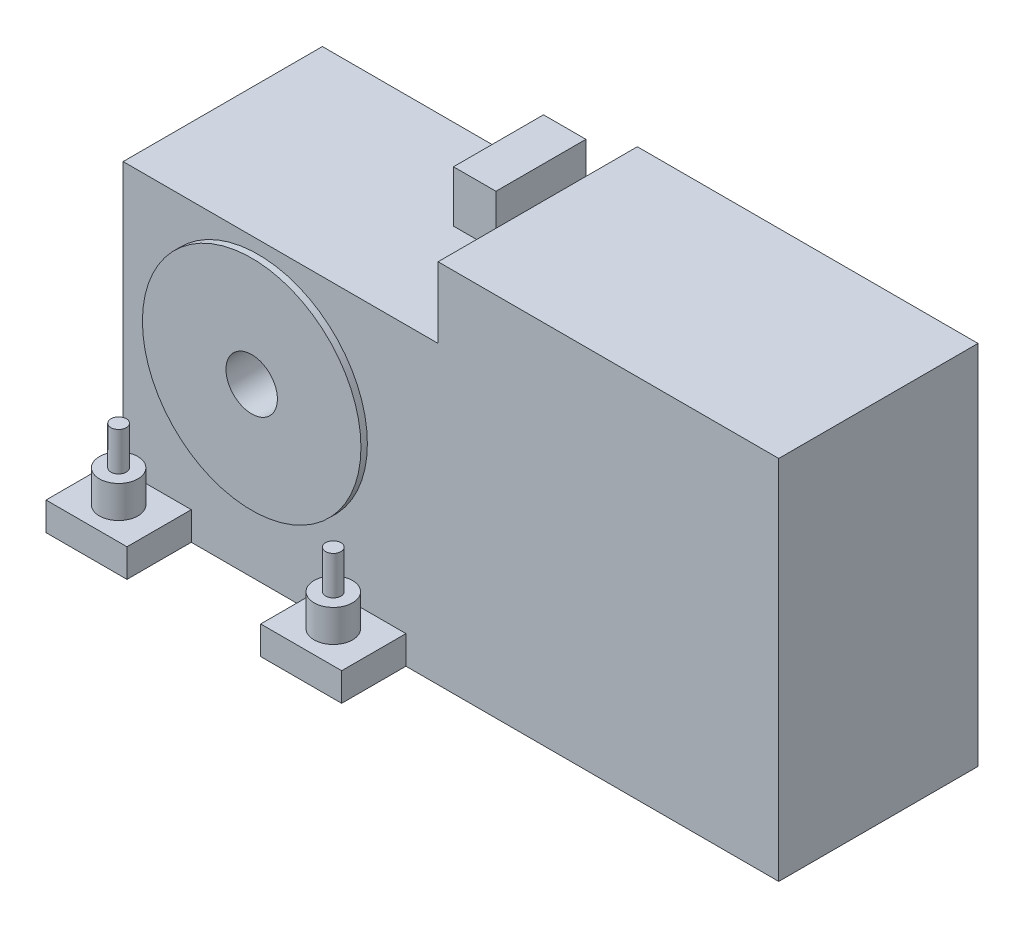
ISO-10303-21;
HEADER;
FILE_DESCRIPTION(('STEP AP214'),'2;1');
FILE_NAME('part.step','',(''),(''),'','','');
FILE_SCHEMA(('AUTOMOTIVE_DESIGN { 1 0 10303 214 1 1 1 1 }'));
ENDSEC;
DATA;
#1=APPLICATION_CONTEXT('core data for automotive mechanical design processes');
#2=APPLICATION_PROTOCOL_DEFINITION('international standard','automotive_design',2000,#1);
#3=PRODUCT_CONTEXT('',#1,'mechanical');
#4=PRODUCT('Part','Part','',(#3));
#5=PRODUCT_RELATED_PRODUCT_CATEGORY('part','',(#4));
#6=PRODUCT_DEFINITION_FORMATION('','',#4);
#7=PRODUCT_DEFINITION_CONTEXT('part definition',#1,'design');
#8=PRODUCT_DEFINITION('design','',#6,#7);
#9=PRODUCT_DEFINITION_SHAPE('','',#8);
#10=(LENGTH_UNIT() NAMED_UNIT(*) SI_UNIT(.MILLI.,.METRE.));
#11=(NAMED_UNIT(*) PLANE_ANGLE_UNIT() SI_UNIT($,.RADIAN.));
#12=(NAMED_UNIT(*) SI_UNIT($,.STERADIAN.) SOLID_ANGLE_UNIT());
#13=UNCERTAINTY_MEASURE_WITH_UNIT(LENGTH_MEASURE(1.E-05),#10,'distance_accuracy_value','');
#14=(GEOMETRIC_REPRESENTATION_CONTEXT(3) GLOBAL_UNCERTAINTY_ASSIGNED_CONTEXT((#13)) GLOBAL_UNIT_ASSIGNED_CONTEXT((#10,
#11,#12)) REPRESENTATION_CONTEXT('',''));
#15=CARTESIAN_POINT('',(0.,0.,0.));
#16=DIRECTION('',(0.,0.,1.));
#17=DIRECTION('',(1.,0.,0.));
#18=AXIS2_PLACEMENT_3D('',#15,#16,#17);
#19=CARTESIAN_POINT('',(0.,0.,0.));
#20=DIRECTION('',(0.,0.,-1.));
#21=DIRECTION('',(-1.,0.,0.));
#22=AXIS2_PLACEMENT_3D('',#19,#20,#21);
#23=PLANE('',#22);
#24=CARTESIAN_POINT('',(0.,0.,0.));
#25=DIRECTION('',(0.,0.,1.));
#26=DIRECTION('',(1.,0.,0.));
#27=AXIS2_PLACEMENT_3D('',#24,#25,#26);
#28=CIRCLE('',#27,85.);
#29=CARTESIAN_POINT('',(85.,0.,0.));
#30=VERTEX_POINT('',#29);
#31=EDGE_CURVE('E45',#30,#30,#28,.T.);
#32=ORIENTED_EDGE('',*,*,#31,.F.);
#33=EDGE_LOOP('',(#32));
#34=FACE_BOUND('',#33,.T.);
#35=DIRECTION('',(0.,-1.,0.));
#36=VECTOR('',#35,1.);
#37=CARTESIAN_POINT('',(52.,-113.,0.));
#38=LINE('',#37,#36);
#39=CARTESIAN_POINT('',(52.,-113.,0.));
#40=VERTEX_POINT('',#39);
#41=CARTESIAN_POINT('',(52.,-135.,0.));
#42=VERTEX_POINT('',#41);
#43=EDGE_CURVE('E57',#40,#42,#38,.T.);
#44=ORIENTED_EDGE('',*,*,#43,.F.);
#45=DIRECTION('',(-1.,0.,0.));
#46=VECTOR('',#45,1.);
#47=CARTESIAN_POINT('',(0.,-113.,0.));
#48=LINE('',#47,#46);
#49=CARTESIAN_POINT('',(115.,-113.,0.));
#50=VERTEX_POINT('',#49);
#51=EDGE_CURVE('E62',#50,#40,#48,.T.);
#52=ORIENTED_EDGE('',*,*,#51,.F.);
#53=DIRECTION('',(0.,-1.,0.));
#54=VECTOR('',#53,1.);
#55=CARTESIAN_POINT('',(115.,-113.,0.));
#56=LINE('',#55,#54);
#57=CARTESIAN_POINT('',(115.,-135.,0.));
#58=VERTEX_POINT('',#57);
#59=EDGE_CURVE('E181',#50,#58,#56,.T.);
#60=ORIENTED_EDGE('',*,*,#59,.T.);
#61=DIRECTION('',(1.,0.,0.));
#62=VECTOR('',#61,1.);
#63=CARTESIAN_POINT('',(0.,-135.,0.));
#64=LINE('',#63,#62);
#65=CARTESIAN_POINT('',(405.,-135.,0.));
#66=VERTEX_POINT('',#65);
#67=EDGE_CURVE('E263',#58,#66,#64,.T.);
#68=ORIENTED_EDGE('',*,*,#67,.T.);
#69=DIRECTION('',(0.,-1.,0.));
#70=VECTOR('',#69,1.);
#71=CARTESIAN_POINT('',(405.,-1.57768535078312E-13,0.));
#72=LINE('',#71,#70);
#73=CARTESIAN_POINT('',(405.,150.,0.));
#74=VERTEX_POINT('',#73);
#75=EDGE_CURVE('E275',#74,#66,#72,.T.);
#76=ORIENTED_EDGE('',*,*,#75,.F.);
#77=DIRECTION('',(-1.,0.,0.));
#78=VECTOR('',#77,1.);
#79=CARTESIAN_POINT('',(0.,150.,0.));
#80=LINE('',#79,#78);
#81=CARTESIAN_POINT('',(140.,150.,0.));
#82=VERTEX_POINT('',#81);
#83=EDGE_CURVE('E306',#74,#82,#80,.T.);
#84=ORIENTED_EDGE('',*,*,#83,.T.);
#85=DIRECTION('',(0.,-1.,0.));
#86=VECTOR('',#85,1.);
#87=CARTESIAN_POINT('',(140.,0.,0.));
#88=LINE('',#87,#86);
#89=CARTESIAN_POINT('',(140.,95.,0.));
#90=VERTEX_POINT('',#89);
#91=EDGE_CURVE('E303',#82,#90,#88,.T.);
#92=ORIENTED_EDGE('',*,*,#91,.T.);
#93=DIRECTION('',(1.,0.,0.));
#94=VECTOR('',#93,1.);
#95=CARTESIAN_POINT('',(0.,95.,0.));
#96=LINE('',#95,#94);
#97=CARTESIAN_POINT('',(-105.,95.,0.));
#98=VERTEX_POINT('',#97);
#99=EDGE_CURVE('E300',#98,#90,#96,.T.);
#100=ORIENTED_EDGE('',*,*,#99,.F.);
#101=DIRECTION('',(0.,-1.,0.));
#102=VECTOR('',#101,1.);
#103=CARTESIAN_POINT('',(-105.,0.,0.));
#104=LINE('',#103,#102);
#105=CARTESIAN_POINT('',(-105.,-113.,0.));
#106=VERTEX_POINT('',#105);
#107=EDGE_CURVE('E297',#98,#106,#104,.T.);
#108=ORIENTED_EDGE('',*,*,#107,.T.);
#109=DIRECTION('',(-1.,0.,0.));
#110=VECTOR('',#109,1.);
#111=CARTESIAN_POINT('',(0.,-113.,0.));
#112=LINE('',#111,#110);
#113=CARTESIAN_POINT('',(-52.,-113.,0.));
#114=VERTEX_POINT('',#113);
#115=EDGE_CURVE('E211',#114,#106,#112,.T.);
#116=ORIENTED_EDGE('',*,*,#115,.F.);
#117=DIRECTION('',(0.,-1.,0.));
#118=VECTOR('',#117,1.);
#119=CARTESIAN_POINT('',(-52.,-113.,0.));
#120=LINE('',#119,#118);
#121=CARTESIAN_POINT('',(-52.,-135.,0.));
#122=VERTEX_POINT('',#121);
#123=EDGE_CURVE('E222',#114,#122,#120,.T.);
#124=ORIENTED_EDGE('',*,*,#123,.T.);
#125=EDGE_CURVE('E294',#122,#42,#64,.T.);
#126=ORIENTED_EDGE('',*,*,#125,.T.);
#127=EDGE_LOOP('',(#44,#52,#60,#68,#76,#84,#92,#100,#108,#116,#124,#126));
#128=FACE_BOUND('',#127,.T.);
#129=ADVANCED_FACE('F41',(#34,#128),#23,.F.);
#130=CARTESIAN_POINT('',(0.,95.,-155.));
#131=DIRECTION('',(0.,-1.,0.));
#132=DIRECTION('',(1.,0.,0.));
#133=AXIS2_PLACEMENT_3D('',#130,#131,#132);
#134=PLANE('',#133);
#135=DIRECTION('',(0.,0.,-1.));
#136=VECTOR('',#135,1.);
#137=CARTESIAN_POINT('',(100.,95.,-85.));
#138=LINE('',#137,#136);
#139=CARTESIAN_POINT('',(100.,95.,-85.));
#140=VERTEX_POINT('',#139);
#141=CARTESIAN_POINT('',(100.,95.,-155.));
#142=VERTEX_POINT('',#141);
#143=EDGE_CURVE('E261',#140,#142,#138,.T.);
#144=ORIENTED_EDGE('',*,*,#143,.F.);
#145=DIRECTION('',(1.,0.,0.));
#146=VECTOR('',#145,1.);
#147=CARTESIAN_POINT('',(0.,95.,-85.));
#148=LINE('',#147,#146);
#149=CARTESIAN_POINT('',(67.0000000000001,95.,-85.));
#150=VERTEX_POINT('',#149);
#151=EDGE_CURVE('E243',#150,#140,#148,.T.);
#152=ORIENTED_EDGE('',*,*,#151,.F.);
#153=DIRECTION('',(0.,0.,-1.));
#154=VECTOR('',#153,1.);
#155=CARTESIAN_POINT('',(67.0000000000001,95.,-85.));
#156=LINE('',#155,#154);
#157=CARTESIAN_POINT('',(67.0000000000001,95.,-155.));
#158=VERTEX_POINT('',#157);
#159=EDGE_CURVE('E254',#150,#158,#156,.T.);
#160=ORIENTED_EDGE('',*,*,#159,.T.);
#161=DIRECTION('',(1.,0.,0.));
#162=VECTOR('',#161,1.);
#163=CARTESIAN_POINT('',(0.,95.,-155.));
#164=LINE('',#163,#162);
#165=CARTESIAN_POINT('',(-105.,95.,-155.));
#166=VERTEX_POINT('',#165);
#167=EDGE_CURVE('E279',#166,#158,#164,.T.);
#168=ORIENTED_EDGE('',*,*,#167,.F.);
#169=DIRECTION('',(0.,0.,1.));
#170=VECTOR('',#169,1.);
#171=CARTESIAN_POINT('',(-105.,95.,-155.));
#172=LINE('',#171,#170);
#173=EDGE_CURVE('E319',#166,#98,#172,.T.);
#174=ORIENTED_EDGE('',*,*,#173,.T.);
#175=ORIENTED_EDGE('',*,*,#99,.T.);
#176=DIRECTION('',(0.,0.,1.));
#177=VECTOR('',#176,1.);
#178=CARTESIAN_POINT('',(140.,95.,-155.));
#179=LINE('',#178,#177);
#180=CARTESIAN_POINT('',(140.,95.,-155.));
#181=VERTEX_POINT('',#180);
#182=EDGE_CURVE('E317',#181,#90,#179,.T.);
#183=ORIENTED_EDGE('',*,*,#182,.F.);
#184=EDGE_CURVE('E278',#142,#181,#164,.T.);
#185=ORIENTED_EDGE('',*,*,#184,.F.);
#186=EDGE_LOOP('',(#144,#152,#160,#168,#174,#175,#183,#185));
#187=FACE_BOUND('',#186,.T.);
#188=ADVANCED_FACE('F332',(#187),#134,.F.);
#189=CARTESIAN_POINT('',(0.,0.,5.));
#190=DIRECTION('',(0.,0.,-1.));
#191=DIRECTION('',(-1.,0.,0.));
#192=AXIS2_PLACEMENT_3D('',#189,#190,#191);
#193=CYLINDRICAL_SURFACE('',#192,20.);
#194=CARTESIAN_POINT('',(0.,0.,5.));
#195=DIRECTION('',(0.,0.,1.));
#196=DIRECTION('',(1.,0.,0.));
#197=AXIS2_PLACEMENT_3D('',#194,#195,#196);
#198=CIRCLE('',#197,20.);
#199=CARTESIAN_POINT('',(20.,0.,5.));
#200=VERTEX_POINT('',#199);
#201=EDGE_CURVE('E50',#200,#200,#198,.T.);
#202=ORIENTED_EDGE('',*,*,#201,.T.);
#203=EDGE_LOOP('',(#202));
#204=FACE_BOUND('',#203,.T.);
#205=CARTESIAN_POINT('',(0.,0.,-155.));
#206=DIRECTION('',(0.,0.,-1.));
#207=DIRECTION('',(-1.,0.,0.));
#208=AXIS2_PLACEMENT_3D('',#205,#206,#207);
#209=CIRCLE('',#208,20.);
#210=CARTESIAN_POINT('',(-20.,0.,-155.));
#211=VERTEX_POINT('',#210);
#212=EDGE_CURVE('E290',#211,#211,#209,.F.);
#213=ORIENTED_EDGE('',*,*,#212,.F.);
#214=EDGE_LOOP('',(#213));
#215=FACE_BOUND('',#214,.T.);
#216=ADVANCED_FACE('F43',(#204,#215),#193,.F.);
#217=CARTESIAN_POINT('',(0.,0.,5.));
#218=DIRECTION('',(0.,0.,-1.));
#219=DIRECTION('',(-1.,0.,0.));
#220=AXIS2_PLACEMENT_3D('',#217,#218,#219);
#221=CYLINDRICAL_SURFACE('',#220,85.);
#222=CARTESIAN_POINT('',(0.,0.,5.));
#223=DIRECTION('',(0.,0.,1.));
#224=DIRECTION('',(1.,0.,0.));
#225=AXIS2_PLACEMENT_3D('',#222,#223,#224);
#226=CIRCLE('',#225,85.);
#227=CARTESIAN_POINT('',(85.,0.,5.));
#228=VERTEX_POINT('',#227);
#229=EDGE_CURVE('E11',#228,#228,#226,.T.);
#230=ORIENTED_EDGE('',*,*,#229,.F.);
#231=EDGE_LOOP('',(#230));
#232=FACE_BOUND('',#231,.T.);
#233=ORIENTED_EDGE('',*,*,#31,.T.);
#234=EDGE_LOOP('',(#233));
#235=FACE_BOUND('',#234,.T.);
#236=ADVANCED_FACE('F329',(#232,#235),#221,.T.);
#237=CARTESIAN_POINT('',(0.,0.,5.));
#238=DIRECTION('',(0.,0.,1.));
#239=DIRECTION('',(1.,0.,0.));
#240=AXIS2_PLACEMENT_3D('',#237,#238,#239);
#241=PLANE('',#240);
#242=ORIENTED_EDGE('',*,*,#201,.F.);
#243=EDGE_LOOP('',(#242));
#244=FACE_BOUND('',#243,.T.);
#245=ORIENTED_EDGE('',*,*,#229,.T.);
#246=EDGE_LOOP('',(#245));
#247=FACE_BOUND('',#246,.T.);
#248=ADVANCED_FACE('F363',(#244,#247),#241,.T.);
#249=CARTESIAN_POINT('',(0.,-135.,-155.));
#250=DIRECTION('',(0.,-1.,0.));
#251=DIRECTION('',(0.,0.,-1.));
#252=AXIS2_PLACEMENT_3D('',#249,#250,#251);
#253=PLANE('',#252);
#254=ORIENTED_EDGE('',*,*,#125,.F.);
#255=DIRECTION('',(0.,0.,1.));
#256=VECTOR('',#255,1.);
#257=CARTESIAN_POINT('',(-52.,-135.,0.));
#258=LINE('',#257,#256);
#259=CARTESIAN_POINT('',(-52.,-135.,50.));
#260=VERTEX_POINT('',#259);
#261=EDGE_CURVE('E224',#122,#260,#258,.T.);
#262=ORIENTED_EDGE('',*,*,#261,.T.);
#263=DIRECTION('',(1.,0.,0.));
#264=VECTOR('',#263,1.);
#265=CARTESIAN_POINT('',(0.,-135.,50.));
#266=LINE('',#265,#264);
#267=CARTESIAN_POINT('',(-115.,-135.,50.));
#268=VERTEX_POINT('',#267);
#269=EDGE_CURVE('E227',#268,#260,#266,.T.);
#270=ORIENTED_EDGE('',*,*,#269,.F.);
#271=DIRECTION('',(0.,0.,1.));
#272=VECTOR('',#271,1.);
#273=CARTESIAN_POINT('',(-115.,-135.,0.));
#274=LINE('',#273,#272);
#275=CARTESIAN_POINT('',(-115.,-135.,0.));
#276=VERTEX_POINT('',#275);
#277=EDGE_CURVE('E230',#276,#268,#274,.T.);
#278=ORIENTED_EDGE('',*,*,#277,.F.);
#279=DIRECTION('',(-1.,0.,0.));
#280=VECTOR('',#279,1.);
#281=CARTESIAN_POINT('',(0.,-135.,0.));
#282=LINE('',#281,#280);
#283=CARTESIAN_POINT('',(-105.,-135.,0.));
#284=VERTEX_POINT('',#283);
#285=EDGE_CURVE('E208',#284,#276,#282,.T.);
#286=ORIENTED_EDGE('',*,*,#285,.F.);
#287=DIRECTION('',(0.,0.,1.));
#288=VECTOR('',#287,1.);
#289=CARTESIAN_POINT('',(-105.,-135.,-155.));
#290=LINE('',#289,#288);
#291=CARTESIAN_POINT('',(-105.,-135.,-155.));
#292=VERTEX_POINT('',#291);
#293=EDGE_CURVE('E321',#292,#284,#290,.T.);
#294=ORIENTED_EDGE('',*,*,#293,.F.);
#295=DIRECTION('',(1.,0.,0.));
#296=VECTOR('',#295,1.);
#297=CARTESIAN_POINT('',(0.,-135.,-155.));
#298=LINE('',#297,#296);
#299=CARTESIAN_POINT('',(405.,-135.,-155.));
#300=VERTEX_POINT('',#299);
#301=EDGE_CURVE('E271',#292,#300,#298,.T.);
#302=ORIENTED_EDGE('',*,*,#301,.T.);
#303=DIRECTION('',(0.,0.,1.));
#304=VECTOR('',#303,1.);
#305=CARTESIAN_POINT('',(405.,-135.,-155.));
#306=LINE('',#305,#304);
#307=EDGE_CURVE('E293',#300,#66,#306,.T.);
#308=ORIENTED_EDGE('',*,*,#307,.T.);
#309=ORIENTED_EDGE('',*,*,#67,.F.);
#310=DIRECTION('',(0.,0.,1.));
#311=VECTOR('',#310,1.);
#312=CARTESIAN_POINT('',(115.,-135.,0.));
#313=LINE('',#312,#311);
#314=CARTESIAN_POINT('',(115.,-135.,50.));
#315=VERTEX_POINT('',#314);
#316=EDGE_CURVE('E201',#58,#315,#313,.T.);
#317=ORIENTED_EDGE('',*,*,#316,.T.);
#318=DIRECTION('',(-1.,0.,0.));
#319=VECTOR('',#318,1.);
#320=CARTESIAN_POINT('',(0.,-135.,50.));
#321=LINE('',#320,#319);
#322=CARTESIAN_POINT('',(52.,-135.,50.));
#323=VERTEX_POINT('',#322);
#324=EDGE_CURVE('E175',#315,#323,#321,.T.);
#325=ORIENTED_EDGE('',*,*,#324,.T.);
#326=DIRECTION('',(0.,0.,1.));
#327=VECTOR('',#326,1.);
#328=CARTESIAN_POINT('',(52.,-135.,0.));
#329=LINE('',#328,#327);
#330=EDGE_CURVE('E193',#42,#323,#329,.T.);
#331=ORIENTED_EDGE('',*,*,#330,.F.);
#332=EDGE_LOOP('',(#254,#262,#270,#278,#286,#294,#302,#308,#309,#317,#325,#331));
#333=FACE_BOUND('',#332,.T.);
#334=ADVANCED_FACE('F359',(#333),#253,.T.);
#335=CARTESIAN_POINT('',(-105.,0.,-155.));
#336=DIRECTION('',(-1.,0.,0.));
#337=DIRECTION('',(0.,-1.,0.));
#338=AXIS2_PLACEMENT_3D('',#335,#336,#337);
#339=PLANE('',#338);
#340=ORIENTED_EDGE('',*,*,#107,.F.);
#341=ORIENTED_EDGE('',*,*,#173,.F.);
#342=DIRECTION('',(0.,-1.,0.));
#343=VECTOR('',#342,1.);
#344=CARTESIAN_POINT('',(-105.,0.,-155.));
#345=LINE('',#344,#343);
#346=EDGE_CURVE('E274',#166,#292,#345,.T.);
#347=ORIENTED_EDGE('',*,*,#346,.T.);
#348=ORIENTED_EDGE('',*,*,#293,.T.);
#349=EDGE_CURVE('E296',#106,#284,#104,.T.);
#350=ORIENTED_EDGE('',*,*,#349,.F.);
#351=EDGE_LOOP('',(#340,#341,#347,#348,#350));
#352=FACE_BOUND('',#351,.T.);
#353=ADVANCED_FACE('F355',(#352),#339,.T.);
#354=CARTESIAN_POINT('',(140.,0.,-155.));
#355=DIRECTION('',(-1.,0.,0.));
#356=DIRECTION('',(0.,-1.,0.));
#357=AXIS2_PLACEMENT_3D('',#354,#355,#356);
#358=PLANE('',#357);
#359=ORIENTED_EDGE('',*,*,#91,.F.);
#360=DIRECTION('',(0.,0.,1.));
#361=VECTOR('',#360,1.);
#362=CARTESIAN_POINT('',(140.,150.,-155.));
#363=LINE('',#362,#361);
#364=CARTESIAN_POINT('',(140.,150.,-155.));
#365=VERTEX_POINT('',#364);
#366=EDGE_CURVE('E315',#365,#82,#363,.T.);
#367=ORIENTED_EDGE('',*,*,#366,.F.);
#368=DIRECTION('',(0.,-1.,0.));
#369=VECTOR('',#368,1.);
#370=CARTESIAN_POINT('',(140.,0.,-155.));
#371=LINE('',#370,#369);
#372=EDGE_CURVE('E282',#365,#181,#371,.T.);
#373=ORIENTED_EDGE('',*,*,#372,.T.);
#374=ORIENTED_EDGE('',*,*,#182,.T.);
#375=EDGE_LOOP('',(#359,#367,#373,#374));
#376=FACE_BOUND('',#375,.T.);
#377=ADVANCED_FACE('F352',(#376),#358,.T.);
#378=CARTESIAN_POINT('',(0.,150.,-155.));
#379=DIRECTION('',(0.,1.,0.));
#380=DIRECTION('',(0.,0.,1.));
#381=AXIS2_PLACEMENT_3D('',#378,#379,#380);
#382=PLANE('',#381);
#383=ORIENTED_EDGE('',*,*,#83,.F.);
#384=DIRECTION('',(0.,0.,1.));
#385=VECTOR('',#384,1.);
#386=CARTESIAN_POINT('',(405.,150.,-155.));
#387=LINE('',#386,#385);
#388=CARTESIAN_POINT('',(405.,150.,-155.));
#389=VERTEX_POINT('',#388);
#390=EDGE_CURVE('E313',#389,#74,#387,.T.);
#391=ORIENTED_EDGE('',*,*,#390,.F.);
#392=DIRECTION('',(-1.,0.,0.));
#393=VECTOR('',#392,1.);
#394=CARTESIAN_POINT('',(0.,150.,-155.));
#395=LINE('',#394,#393);
#396=EDGE_CURVE('E285',#389,#365,#395,.T.);
#397=ORIENTED_EDGE('',*,*,#396,.T.);
#398=ORIENTED_EDGE('',*,*,#366,.T.);
#399=EDGE_LOOP('',(#383,#391,#397,#398));
#400=FACE_BOUND('',#399,.T.);
#401=ADVANCED_FACE('F348',(#400),#382,.T.);
#402=CARTESIAN_POINT('',(405.,-1.57768535078312E-13,-155.));
#403=DIRECTION('',(-1.,0.,0.));
#404=DIRECTION('',(0.,-1.,0.));
#405=AXIS2_PLACEMENT_3D('',#402,#403,#404);
#406=PLANE('',#405);
#407=ORIENTED_EDGE('',*,*,#75,.T.);
#408=ORIENTED_EDGE('',*,*,#307,.F.);
#409=DIRECTION('',(0.,-1.,0.));
#410=VECTOR('',#409,1.);
#411=CARTESIAN_POINT('',(405.,-1.57768535078312E-13,-155.));
#412=LINE('',#411,#410);
#413=EDGE_CURVE('E288',#389,#300,#412,.T.);
#414=ORIENTED_EDGE('',*,*,#413,.F.);
#415=ORIENTED_EDGE('',*,*,#390,.T.);
#416=EDGE_LOOP('',(#407,#408,#414,#415));
#417=FACE_BOUND('',#416,.T.);
#418=ADVANCED_FACE('F345',(#417),#406,.F.);
#419=CARTESIAN_POINT('',(0.,0.,-155.));
#420=DIRECTION('',(0.,0.,-1.));
#421=DIRECTION('',(-1.,0.,0.));
#422=AXIS2_PLACEMENT_3D('',#419,#420,#421);
#423=PLANE('',#422);
#424=ORIENTED_EDGE('',*,*,#301,.F.);
#425=ORIENTED_EDGE('',*,*,#346,.F.);
#426=ORIENTED_EDGE('',*,*,#167,.T.);
#427=DIRECTION('',(0.,1.,0.));
#428=VECTOR('',#427,1.);
#429=CARTESIAN_POINT('',(67.0000000000001,0.,-155.));
#430=LINE('',#429,#428);
#431=CARTESIAN_POINT('',(67.0000000000001,135.,-155.));
#432=VERTEX_POINT('',#431);
#433=EDGE_CURVE('E235',#158,#432,#430,.T.);
#434=ORIENTED_EDGE('',*,*,#433,.T.);
#435=DIRECTION('',(-1.,0.,0.));
#436=VECTOR('',#435,1.);
#437=CARTESIAN_POINT('',(0.,135.,-155.));
#438=LINE('',#437,#436);
#439=CARTESIAN_POINT('',(100.,135.,-155.));
#440=VERTEX_POINT('',#439);
#441=EDGE_CURVE('E257',#440,#432,#438,.T.);
#442=ORIENTED_EDGE('',*,*,#441,.F.);
#443=DIRECTION('',(0.,1.,0.));
#444=VECTOR('',#443,1.);
#445=CARTESIAN_POINT('',(100.,0.,-155.));
#446=LINE('',#445,#444);
#447=EDGE_CURVE('E247',#142,#440,#446,.T.);
#448=ORIENTED_EDGE('',*,*,#447,.F.);
#449=ORIENTED_EDGE('',*,*,#184,.T.);
#450=ORIENTED_EDGE('',*,*,#372,.F.);
#451=ORIENTED_EDGE('',*,*,#396,.F.);
#452=ORIENTED_EDGE('',*,*,#413,.T.);
#453=EDGE_LOOP('',(#424,#425,#426,#434,#442,#448,#449,#450,#451,#452));
#454=FACE_BOUND('',#453,.T.);
#455=ORIENTED_EDGE('',*,*,#212,.T.);
#456=EDGE_LOOP('',(#455));
#457=FACE_BOUND('',#456,.T.);
#458=ADVANCED_FACE('F343',(#454,#457),#423,.T.);
#459=CARTESIAN_POINT('',(100.,0.,-85.));
#460=DIRECTION('',(-1.,0.,0.));
#461=DIRECTION('',(0.,-1.,0.));
#462=AXIS2_PLACEMENT_3D('',#459,#460,#461);
#463=PLANE('',#462);
#464=ORIENTED_EDGE('',*,*,#447,.T.);
#465=DIRECTION('',(0.,0.,-1.));
#466=VECTOR('',#465,1.);
#467=CARTESIAN_POINT('',(100.,135.,-85.));
#468=LINE('',#467,#466);
#469=CARTESIAN_POINT('',(100.,135.,-85.));
#470=VERTEX_POINT('',#469);
#471=EDGE_CURVE('E264',#470,#440,#468,.T.);
#472=ORIENTED_EDGE('',*,*,#471,.F.);
#473=DIRECTION('',(0.,1.,0.));
#474=VECTOR('',#473,1.);
#475=CARTESIAN_POINT('',(100.,0.,-85.));
#476=LINE('',#475,#474);
#477=EDGE_CURVE('E252',#140,#470,#476,.T.);
#478=ORIENTED_EDGE('',*,*,#477,.F.);
#479=ORIENTED_EDGE('',*,*,#143,.T.);
#480=EDGE_LOOP('',(#464,#472,#478,#479));
#481=FACE_BOUND('',#480,.T.);
#482=ADVANCED_FACE('F380',(#481),#463,.F.);
#483=CARTESIAN_POINT('',(0.,135.,-85.));
#484=DIRECTION('',(0.,-1.,0.));
#485=DIRECTION('',(0.,0.,-1.));
#486=AXIS2_PLACEMENT_3D('',#483,#484,#485);
#487=PLANE('',#486);
#488=ORIENTED_EDGE('',*,*,#441,.T.);
#489=DIRECTION('',(0.,0.,-1.));
#490=VECTOR('',#489,1.);
#491=CARTESIAN_POINT('',(67.0000000000001,135.,-85.));
#492=LINE('',#491,#490);
#493=CARTESIAN_POINT('',(67.0000000000001,135.,-85.));
#494=VERTEX_POINT('',#493);
#495=EDGE_CURVE('E267',#494,#432,#492,.T.);
#496=ORIENTED_EDGE('',*,*,#495,.F.);
#497=DIRECTION('',(-1.,0.,0.));
#498=VECTOR('',#497,1.);
#499=CARTESIAN_POINT('',(0.,135.,-85.));
#500=LINE('',#499,#498);
#501=EDGE_CURVE('E250',#470,#494,#500,.T.);
#502=ORIENTED_EDGE('',*,*,#501,.F.);
#503=ORIENTED_EDGE('',*,*,#471,.T.);
#504=EDGE_LOOP('',(#488,#496,#502,#503));
#505=FACE_BOUND('',#504,.T.);
#506=ADVANCED_FACE('F385',(#505),#487,.F.);
#507=CARTESIAN_POINT('',(67.0000000000001,0.,-85.));
#508=DIRECTION('',(-1.,0.,0.));
#509=DIRECTION('',(0.,0.,1.));
#510=AXIS2_PLACEMENT_3D('',#507,#508,#509);
#511=PLANE('',#510);
#512=ORIENTED_EDGE('',*,*,#433,.F.);
#513=ORIENTED_EDGE('',*,*,#159,.F.);
#514=DIRECTION('',(0.,1.,0.));
#515=VECTOR('',#514,1.);
#516=CARTESIAN_POINT('',(67.0000000000001,0.,-85.));
#517=LINE('',#516,#515);
#518=EDGE_CURVE('E246',#150,#494,#517,.T.);
#519=ORIENTED_EDGE('',*,*,#518,.T.);
#520=ORIENTED_EDGE('',*,*,#495,.T.);
#521=EDGE_LOOP('',(#512,#513,#519,#520));
#522=FACE_BOUND('',#521,.T.);
#523=ADVANCED_FACE('F402',(#522),#511,.T.);
#524=CARTESIAN_POINT('',(0.,0.,-85.));
#525=DIRECTION('',(0.,0.,-1.));
#526=DIRECTION('',(-1.,0.,0.));
#527=AXIS2_PLACEMENT_3D('',#524,#525,#526);
#528=PLANE('',#527);
#529=ORIENTED_EDGE('',*,*,#151,.T.);
#530=ORIENTED_EDGE('',*,*,#477,.T.);
#531=ORIENTED_EDGE('',*,*,#501,.T.);
#532=ORIENTED_EDGE('',*,*,#518,.F.);
#533=EDGE_LOOP('',(#529,#530,#531,#532));
#534=FACE_BOUND('',#533,.T.);
#535=ADVANCED_FACE('F458',(#534),#528,.F.);
#536=CARTESIAN_POINT('',(0.,-113.,0.));
#537=DIRECTION('',(0.,0.,1.));
#538=DIRECTION('',(1.,0.,0.));
#539=AXIS2_PLACEMENT_3D('',#536,#537,#538);
#540=PLANE('',#539);
#541=ORIENTED_EDGE('',*,*,#349,.T.);
#542=ORIENTED_EDGE('',*,*,#285,.T.);
#543=DIRECTION('',(0.,-1.,0.));
#544=VECTOR('',#543,1.);
#545=CARTESIAN_POINT('',(-115.,-113.,0.));
#546=LINE('',#545,#544);
#547=CARTESIAN_POINT('',(-115.,-113.,0.));
#548=VERTEX_POINT('',#547);
#549=EDGE_CURVE('E232',#548,#276,#546,.T.);
#550=ORIENTED_EDGE('',*,*,#549,.F.);
#551=EDGE_CURVE('E215',#106,#548,#112,.T.);
#552=ORIENTED_EDGE('',*,*,#551,.F.);
#553=EDGE_LOOP('',(#541,#542,#550,#552));
#554=FACE_BOUND('',#553,.T.);
#555=ADVANCED_FACE('F418',(#554),#540,.F.);
#556=CARTESIAN_POINT('',(-115.,-113.,0.));
#557=DIRECTION('',(1.,0.,0.));
#558=DIRECTION('',(0.,0.,-1.));
#559=AXIS2_PLACEMENT_3D('',#556,#557,#558);
#560=PLANE('',#559);
#561=ORIENTED_EDGE('',*,*,#277,.T.);
#562=DIRECTION('',(0.,-1.,0.));
#563=VECTOR('',#562,1.);
#564=CARTESIAN_POINT('',(-115.,-113.,50.));
#565=LINE('',#564,#563);
#566=CARTESIAN_POINT('',(-115.,-113.,50.));
#567=VERTEX_POINT('',#566);
#568=EDGE_CURVE('E236',#567,#268,#565,.T.);
#569=ORIENTED_EDGE('',*,*,#568,.F.);
#570=DIRECTION('',(0.,0.,1.));
#571=VECTOR('',#570,1.);
#572=CARTESIAN_POINT('',(-115.,-113.,0.));
#573=LINE('',#572,#571);
#574=EDGE_CURVE('E220',#548,#567,#573,.T.);
#575=ORIENTED_EDGE('',*,*,#574,.F.);
#576=ORIENTED_EDGE('',*,*,#549,.T.);
#577=EDGE_LOOP('',(#561,#569,#575,#576));
#578=FACE_BOUND('',#577,.T.);
#579=ADVANCED_FACE('F446',(#578),#560,.F.);
#580=CARTESIAN_POINT('',(0.,-113.,50.));
#581=DIRECTION('',(0.,0.,-1.));
#582=DIRECTION('',(-1.,0.,0.));
#583=AXIS2_PLACEMENT_3D('',#580,#581,#582);
#584=PLANE('',#583);
#585=ORIENTED_EDGE('',*,*,#269,.T.);
#586=DIRECTION('',(0.,-1.,0.));
#587=VECTOR('',#586,1.);
#588=CARTESIAN_POINT('',(-52.,-113.,50.));
#589=LINE('',#588,#587);
#590=CARTESIAN_POINT('',(-52.,-113.,50.));
#591=VERTEX_POINT('',#590);
#592=EDGE_CURVE('E239',#591,#260,#589,.T.);
#593=ORIENTED_EDGE('',*,*,#592,.F.);
#594=DIRECTION('',(1.,0.,0.));
#595=VECTOR('',#594,1.);
#596=CARTESIAN_POINT('',(0.,-113.,50.));
#597=LINE('',#596,#595);
#598=EDGE_CURVE('E218',#567,#591,#597,.T.);
#599=ORIENTED_EDGE('',*,*,#598,.F.);
#600=ORIENTED_EDGE('',*,*,#568,.T.);
#601=EDGE_LOOP('',(#585,#593,#599,#600));
#602=FACE_BOUND('',#601,.T.);
#603=ADVANCED_FACE('F449',(#602),#584,.F.);
#604=CARTESIAN_POINT('',(-52.,-113.,0.));
#605=DIRECTION('',(1.,0.,0.));
#606=DIRECTION('',(0.,0.,-1.));
#607=AXIS2_PLACEMENT_3D('',#604,#605,#606);
#608=PLANE('',#607);
#609=ORIENTED_EDGE('',*,*,#261,.F.);
#610=ORIENTED_EDGE('',*,*,#123,.F.);
#611=DIRECTION('',(0.,0.,1.));
#612=VECTOR('',#611,1.);
#613=CARTESIAN_POINT('',(-52.,-113.,0.));
#614=LINE('',#613,#612);
#615=EDGE_CURVE('E214',#114,#591,#614,.T.);
#616=ORIENTED_EDGE('',*,*,#615,.T.);
#617=ORIENTED_EDGE('',*,*,#592,.T.);
#618=EDGE_LOOP('',(#609,#610,#616,#617));
#619=FACE_BOUND('',#618,.T.);
#620=ADVANCED_FACE('F428',(#619),#608,.T.);
#621=CARTESIAN_POINT('',(0.,-113.,0.));
#622=DIRECTION('',(0.,-1.,0.));
#623=DIRECTION('',(0.,0.,-1.));
#624=AXIS2_PLACEMENT_3D('',#621,#622,#623);
#625=PLANE('',#624);
#626=CARTESIAN_POINT('',(-83.5,-113.,25.));
#627=DIRECTION('',(0.,-1.,0.));
#628=DIRECTION('',(0.,0.,-1.));
#629=AXIS2_PLACEMENT_3D('',#626,#627,#628);
#630=CIRCLE('',#629,15.);
#631=CARTESIAN_POINT('',(-83.5,-113.,10.));
#632=VERTEX_POINT('',#631);
#633=EDGE_CURVE('E203',#632,#632,#630,.T.);
#634=ORIENTED_EDGE('',*,*,#633,.T.);
#635=EDGE_LOOP('',(#634));
#636=FACE_BOUND('',#635,.T.);
#637=ORIENTED_EDGE('',*,*,#115,.T.);
#638=ORIENTED_EDGE('',*,*,#551,.T.);
#639=ORIENTED_EDGE('',*,*,#574,.T.);
#640=ORIENTED_EDGE('',*,*,#598,.T.);
#641=ORIENTED_EDGE('',*,*,#615,.F.);
#642=EDGE_LOOP('',(#637,#638,#639,#640,#641));
#643=FACE_BOUND('',#642,.T.);
#644=ADVANCED_FACE('F423',(#636,#643),#625,.F.);
#645=CARTESIAN_POINT('',(52.,-113.,0.));
#646=DIRECTION('',(1.,0.,0.));
#647=DIRECTION('',(0.,0.,-1.));
#648=AXIS2_PLACEMENT_3D('',#645,#646,#647);
#649=PLANE('',#648);
#650=ORIENTED_EDGE('',*,*,#330,.T.);
#651=DIRECTION('',(0.,-1.,0.));
#652=VECTOR('',#651,1.);
#653=CARTESIAN_POINT('',(52.,-113.,50.));
#654=LINE('',#653,#652);
#655=CARTESIAN_POINT('',(52.,-113.,50.));
#656=VERTEX_POINT('',#655);
#657=EDGE_CURVE('E180',#656,#323,#654,.T.);
#658=ORIENTED_EDGE('',*,*,#657,.F.);
#659=DIRECTION('',(0.,0.,1.));
#660=VECTOR('',#659,1.);
#661=CARTESIAN_POINT('',(52.,-113.,0.));
#662=LINE('',#661,#660);
#663=EDGE_CURVE('E188',#40,#656,#662,.T.);
#664=ORIENTED_EDGE('',*,*,#663,.F.);
#665=ORIENTED_EDGE('',*,*,#43,.T.);
#666=EDGE_LOOP('',(#650,#658,#664,#665));
#667=FACE_BOUND('',#666,.T.);
#668=ADVANCED_FACE('F431',(#667),#649,.F.);
#669=CARTESIAN_POINT('',(0.,-113.,50.));
#670=DIRECTION('',(0.,0.,1.));
#671=DIRECTION('',(1.,0.,0.));
#672=AXIS2_PLACEMENT_3D('',#669,#670,#671);
#673=PLANE('',#672);
#674=ORIENTED_EDGE('',*,*,#324,.F.);
#675=DIRECTION('',(0.,-1.,0.));
#676=VECTOR('',#675,1.);
#677=CARTESIAN_POINT('',(115.,-113.,50.));
#678=LINE('',#677,#676);
#679=CARTESIAN_POINT('',(115.,-113.,50.));
#680=VERTEX_POINT('',#679);
#681=EDGE_CURVE('E170',#680,#315,#678,.T.);
#682=ORIENTED_EDGE('',*,*,#681,.F.);
#683=DIRECTION('',(-1.,0.,0.));
#684=VECTOR('',#683,1.);
#685=CARTESIAN_POINT('',(0.,-113.,50.));
#686=LINE('',#685,#684);
#687=EDGE_CURVE('E173',#680,#656,#686,.T.);
#688=ORIENTED_EDGE('',*,*,#687,.T.);
#689=ORIENTED_EDGE('',*,*,#657,.T.);
#690=EDGE_LOOP('',(#674,#682,#688,#689));
#691=FACE_BOUND('',#690,.T.);
#692=ADVANCED_FACE('F172',(#691),#673,.T.);
#693=CARTESIAN_POINT('',(115.,-113.,0.));
#694=DIRECTION('',(1.,0.,0.));
#695=DIRECTION('',(0.,0.,-1.));
#696=AXIS2_PLACEMENT_3D('',#693,#694,#695);
#697=PLANE('',#696);
#698=ORIENTED_EDGE('',*,*,#316,.F.);
#699=ORIENTED_EDGE('',*,*,#59,.F.);
#700=DIRECTION('',(0.,0.,1.));
#701=VECTOR('',#700,1.);
#702=CARTESIAN_POINT('',(115.,-113.,0.));
#703=LINE('',#702,#701);
#704=EDGE_CURVE('E187',#50,#680,#703,.T.);
#705=ORIENTED_EDGE('',*,*,#704,.T.);
#706=ORIENTED_EDGE('',*,*,#681,.T.);
#707=EDGE_LOOP('',(#698,#699,#705,#706));
#708=FACE_BOUND('',#707,.T.);
#709=ADVANCED_FACE('F191',(#708),#697,.T.);
#710=CARTESIAN_POINT('',(0.,-113.,0.));
#711=DIRECTION('',(0.,-1.,0.));
#712=DIRECTION('',(0.,0.,-1.));
#713=AXIS2_PLACEMENT_3D('',#710,#711,#712);
#714=PLANE('',#713);
#715=ORIENTED_EDGE('',*,*,#51,.T.);
#716=ORIENTED_EDGE('',*,*,#663,.T.);
#717=ORIENTED_EDGE('',*,*,#687,.F.);
#718=ORIENTED_EDGE('',*,*,#704,.F.);
#719=EDGE_LOOP('',(#715,#716,#717,#718));
#720=FACE_BOUND('',#719,.T.);
#721=CARTESIAN_POINT('',(83.5,-113.,25.));
#722=DIRECTION('',(0.,-1.,0.));
#723=DIRECTION('',(0.,0.,-1.));
#724=AXIS2_PLACEMENT_3D('',#721,#722,#723);
#725=CIRCLE('',#724,15.);
#726=CARTESIAN_POINT('',(83.5,-113.,10.));
#727=VERTEX_POINT('',#726);
#728=EDGE_CURVE('E198',#727,#727,#725,.F.);
#729=ORIENTED_EDGE('',*,*,#728,.F.);
#730=EDGE_LOOP('',(#729));
#731=FACE_BOUND('',#730,.T.);
#732=ADVANCED_FACE('F185',(#720,#731),#714,.F.);
#733=CARTESIAN_POINT('',(-83.5,-88.,25.));
#734=DIRECTION('',(0.,-1.,0.));
#735=DIRECTION('',(0.,0.,-1.));
#736=AXIS2_PLACEMENT_3D('',#733,#734,#735);
#737=CYLINDRICAL_SURFACE('',#736,15.);
#738=CARTESIAN_POINT('',(-83.5,-88.,25.));
#739=DIRECTION('',(0.,-1.,0.));
#740=DIRECTION('',(0.,0.,-1.));
#741=AXIS2_PLACEMENT_3D('',#738,#739,#740);
#742=CIRCLE('',#741,15.);
#743=CARTESIAN_POINT('',(-83.5,-88.,10.));
#744=VERTEX_POINT('',#743);
#745=EDGE_CURVE('E650',#744,#744,#742,.T.);
#746=ORIENTED_EDGE('',*,*,#745,.T.);
#747=EDGE_LOOP('',(#746));
#748=FACE_BOUND('',#747,.T.);
#749=ORIENTED_EDGE('',*,*,#633,.F.);
#750=EDGE_LOOP('',(#749));
#751=FACE_BOUND('',#750,.T.);
#752=ADVANCED_FACE('F556',(#748,#751),#737,.T.);
#753=CARTESIAN_POINT('',(0.,-88.,0.));
#754=DIRECTION('',(0.,-1.,0.));
#755=DIRECTION('',(0.,0.,-1.));
#756=AXIS2_PLACEMENT_3D('',#753,#754,#755);
#757=PLANE('',#756);
#758=CARTESIAN_POINT('',(-83.5,-88.,25.));
#759=DIRECTION('',(0.,-1.,0.));
#760=DIRECTION('',(0.,0.,-1.));
#761=AXIS2_PLACEMENT_3D('',#758,#759,#760);
#762=CIRCLE('',#761,6.);
#763=CARTESIAN_POINT('',(-83.5,-88.,19.));
#764=VERTEX_POINT('',#763);
#765=EDGE_CURVE('E656',#764,#764,#762,.T.);
#766=ORIENTED_EDGE('',*,*,#765,.T.);
#767=EDGE_LOOP('',(#766));
#768=FACE_BOUND('',#767,.T.);
#769=ORIENTED_EDGE('',*,*,#745,.F.);
#770=EDGE_LOOP('',(#769));
#771=FACE_BOUND('',#770,.T.);
#772=ADVANCED_FACE('F564',(#768,#771),#757,.F.);
#773=CARTESIAN_POINT('',(83.5,-88.,25.));
#774=DIRECTION('',(0.,-1.,0.));
#775=DIRECTION('',(0.,0.,-1.));
#776=AXIS2_PLACEMENT_3D('',#773,#774,#775);
#777=CYLINDRICAL_SURFACE('',#776,15.);
#778=CARTESIAN_POINT('',(83.5,-88.,25.));
#779=DIRECTION('',(0.,-1.,0.));
#780=DIRECTION('',(0.,0.,-1.));
#781=AXIS2_PLACEMENT_3D('',#778,#779,#780);
#782=CIRCLE('',#781,15.);
#783=CARTESIAN_POINT('',(83.5,-88.,10.));
#784=VERTEX_POINT('',#783);
#785=EDGE_CURVE('E651',#784,#784,#782,.F.);
#786=ORIENTED_EDGE('',*,*,#785,.F.);
#787=EDGE_LOOP('',(#786));
#788=FACE_BOUND('',#787,.T.);
#789=ORIENTED_EDGE('',*,*,#728,.T.);
#790=EDGE_LOOP('',(#789));
#791=FACE_BOUND('',#790,.T.);
#792=ADVANCED_FACE('F571',(#788,#791),#777,.T.);
#793=CARTESIAN_POINT('',(0.,-88.,0.));
#794=DIRECTION('',(0.,-1.,0.));
#795=DIRECTION('',(0.,0.,-1.));
#796=AXIS2_PLACEMENT_3D('',#793,#794,#795);
#797=PLANE('',#796);
#798=ORIENTED_EDGE('',*,*,#785,.T.);
#799=EDGE_LOOP('',(#798));
#800=FACE_BOUND('',#799,.T.);
#801=CARTESIAN_POINT('',(83.5,-88.,25.));
#802=DIRECTION('',(0.,-1.,0.));
#803=DIRECTION('',(0.,0.,-1.));
#804=AXIS2_PLACEMENT_3D('',#801,#802,#803);
#805=CIRCLE('',#804,6.);
#806=CARTESIAN_POINT('',(83.5,-88.,19.));
#807=VERTEX_POINT('',#806);
#808=EDGE_CURVE('E648',#807,#807,#805,.F.);
#809=ORIENTED_EDGE('',*,*,#808,.F.);
#810=EDGE_LOOP('',(#809));
#811=FACE_BOUND('',#810,.T.);
#812=ADVANCED_FACE('F580',(#800,#811),#797,.F.);
#813=CARTESIAN_POINT('',(0.,-58.,0.));
#814=DIRECTION('',(0.,-1.,0.));
#815=DIRECTION('',(0.,0.,-1.));
#816=AXIS2_PLACEMENT_3D('',#813,#814,#815);
#817=PLANE('',#816);
#818=CARTESIAN_POINT('',(-83.5,-58.,25.));
#819=DIRECTION('',(0.,-1.,0.));
#820=DIRECTION('',(0.,0.,-1.));
#821=AXIS2_PLACEMENT_3D('',#818,#819,#820);
#822=CIRCLE('',#821,6.);
#823=CARTESIAN_POINT('',(-83.5,-58.,19.));
#824=VERTEX_POINT('',#823);
#825=EDGE_CURVE('E664',#824,#824,#822,.T.);
#826=ORIENTED_EDGE('',*,*,#825,.F.);
#827=EDGE_LOOP('',(#826));
#828=FACE_BOUND('',#827,.T.);
#829=ADVANCED_FACE('F588',(#828),#817,.F.);
#830=CARTESIAN_POINT('',(-83.5,-58.,25.));
#831=DIRECTION('',(0.,-1.,0.));
#832=DIRECTION('',(0.,0.,-1.));
#833=AXIS2_PLACEMENT_3D('',#830,#831,#832);
#834=CYLINDRICAL_SURFACE('',#833,6.);
#835=ORIENTED_EDGE('',*,*,#825,.T.);
#836=EDGE_LOOP('',(#835));
#837=FACE_BOUND('',#836,.T.);
#838=ORIENTED_EDGE('',*,*,#765,.F.);
#839=EDGE_LOOP('',(#838));
#840=FACE_BOUND('',#839,.T.);
#841=ADVANCED_FACE('F603',(#837,#840),#834,.T.);
#842=CARTESIAN_POINT('',(0.,-58.,0.));
#843=DIRECTION('',(0.,-1.,0.));
#844=DIRECTION('',(0.,0.,-1.));
#845=AXIS2_PLACEMENT_3D('',#842,#843,#844);
#846=PLANE('',#845);
#847=CARTESIAN_POINT('',(83.5,-58.,25.));
#848=DIRECTION('',(0.,-1.,0.));
#849=DIRECTION('',(0.,0.,-1.));
#850=AXIS2_PLACEMENT_3D('',#847,#848,#849);
#851=CIRCLE('',#850,6.);
#852=CARTESIAN_POINT('',(83.5,-58.,19.));
#853=VERTEX_POINT('',#852);
#854=EDGE_CURVE('E645',#853,#853,#851,.F.);
#855=ORIENTED_EDGE('',*,*,#854,.T.);
#856=EDGE_LOOP('',(#855));
#857=FACE_BOUND('',#856,.T.);
#858=ADVANCED_FACE('F612',(#857),#846,.F.);
#859=CARTESIAN_POINT('',(83.5,-58.,25.));
#860=DIRECTION('',(0.,-1.,0.));
#861=DIRECTION('',(0.,0.,-1.));
#862=AXIS2_PLACEMENT_3D('',#859,#860,#861);
#863=CYLINDRICAL_SURFACE('',#862,6.);
#864=ORIENTED_EDGE('',*,*,#854,.F.);
#865=EDGE_LOOP('',(#864));
#866=FACE_BOUND('',#865,.T.);
#867=ORIENTED_EDGE('',*,*,#808,.T.);
#868=EDGE_LOOP('',(#867));
#869=FACE_BOUND('',#868,.T.);
#870=ADVANCED_FACE('F621',(#866,#869),#863,.T.);
#871=CLOSED_SHELL('',(#129,#188,#216,#236,#248,#334,#353,#377,#401,#418,#458,#482,#506,#523,
#535,#555,#579,#603,#620,#644,#668,#692,#709,#732,#752,#772,#792,#812,#829,#841,#858,#870));
#872=MANIFOLD_SOLID_BREP('B2',#871);
#873=ADVANCED_BREP_SHAPE_REPRESENTATION('',(#18,#872),#14);
#874=SHAPE_DEFINITION_REPRESENTATION(#9,#873);
ENDSEC;
END-ISO-10303-21;
